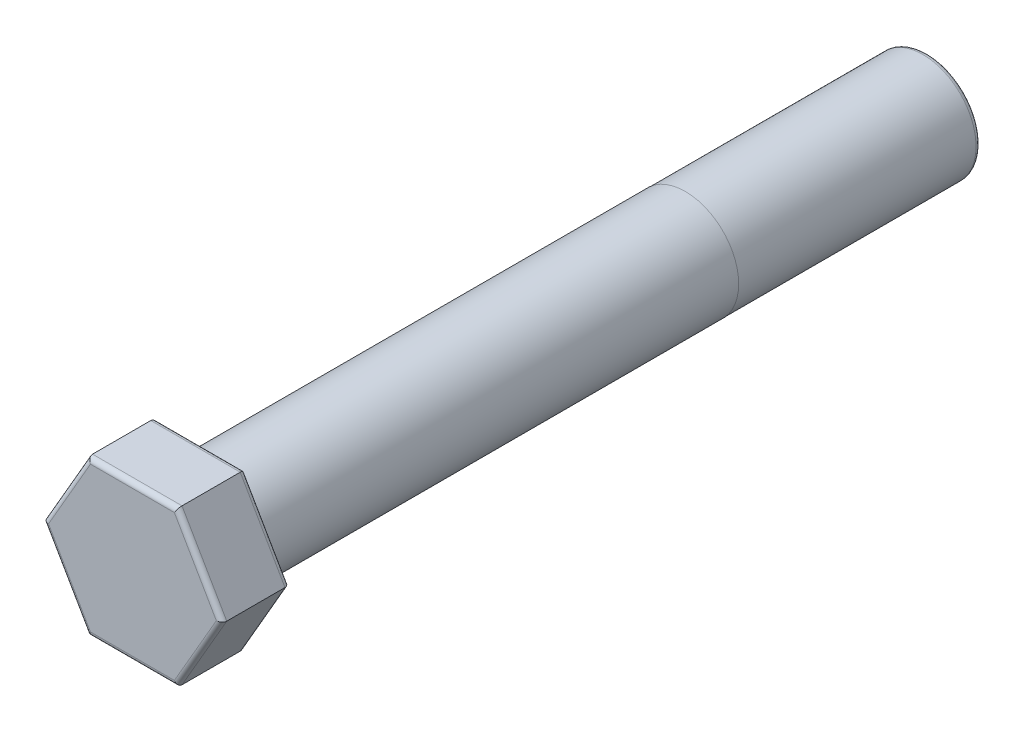
ISO-10303-21;
HEADER;
FILE_DESCRIPTION(('STEP AP214'),'2;1');
FILE_NAME('part.step','',(''),(''),'','','');
FILE_SCHEMA(('AUTOMOTIVE_DESIGN { 1 0 10303 214 1 1 1 1 }'));
ENDSEC;
DATA;
#1=APPLICATION_CONTEXT('core data for automotive mechanical design processes');
#2=APPLICATION_PROTOCOL_DEFINITION('international standard','automotive_design',2000,#1);
#3=PRODUCT_CONTEXT('',#1,'mechanical');
#4=PRODUCT('Part','Part','',(#3));
#5=PRODUCT_RELATED_PRODUCT_CATEGORY('part','',(#4));
#6=PRODUCT_DEFINITION_FORMATION('','',#4);
#7=PRODUCT_DEFINITION_CONTEXT('part definition',#1,'design');
#8=PRODUCT_DEFINITION('design','',#6,#7);
#9=PRODUCT_DEFINITION_SHAPE('','',#8);
#10=(LENGTH_UNIT() NAMED_UNIT(*) SI_UNIT(.MILLI.,.METRE.));
#11=(NAMED_UNIT(*) PLANE_ANGLE_UNIT() SI_UNIT($,.RADIAN.));
#12=(NAMED_UNIT(*) SI_UNIT($,.STERADIAN.) SOLID_ANGLE_UNIT());
#13=UNCERTAINTY_MEASURE_WITH_UNIT(LENGTH_MEASURE(1.E-05),#10,'distance_accuracy_value','');
#14=(GEOMETRIC_REPRESENTATION_CONTEXT(3) GLOBAL_UNCERTAINTY_ASSIGNED_CONTEXT((#13)) GLOBAL_UNIT_ASSIGNED_CONTEXT((#10,
#11,#12)) REPRESENTATION_CONTEXT('',''));
#15=CARTESIAN_POINT('',(0.,0.,0.));
#16=DIRECTION('',(0.,0.,1.));
#17=DIRECTION('',(1.,0.,0.));
#18=AXIS2_PLACEMENT_3D('',#15,#16,#17);
#19=CARTESIAN_POINT('',(0.,0.,-100.));
#20=DIRECTION('',(0.,0.,-1.));
#21=DIRECTION('',(-1.,0.,0.));
#22=AXIS2_PLACEMENT_3D('',#19,#20,#21);
#23=PLANE('',#22);
#24=CARTESIAN_POINT('',(0.,0.,-100.));
#25=DIRECTION('',(0.,0.,-1.));
#26=DIRECTION('',(-1.,0.,0.));
#27=AXIS2_PLACEMENT_3D('',#24,#25,#26);
#28=CIRCLE('',#27,11.);
#29=CARTESIAN_POINT('',(-11.,0.,-100.));
#30=VERTEX_POINT('',#29);
#31=EDGE_CURVE('E245',#30,#30,#28,.T.);
#32=ORIENTED_EDGE('',*,*,#31,.T.);
#33=EDGE_LOOP('',(#32));
#34=FACE_BOUND('',#33,.T.);
#35=CARTESIAN_POINT('',(0.,0.,-100.));
#36=DIRECTION('',(0.,0.,-1.));
#37=DIRECTION('',(-1.,0.,0.));
#38=AXIS2_PLACEMENT_3D('',#35,#36,#37);
#39=CIRCLE('',#38,10.95);
#40=CARTESIAN_POINT('',(-10.95,0.,-100.));
#41=VERTEX_POINT('',#40);
#42=EDGE_CURVE('E178',#41,#41,#39,.T.);
#43=ORIENTED_EDGE('',*,*,#42,.F.);
#44=EDGE_LOOP('',(#43));
#45=FACE_BOUND('',#44,.T.);
#46=ADVANCED_FACE('F34',(#34,#45),#23,.T.);
#47=CARTESIAN_POINT('',(9.225,-15.9781686998229,0.));
#48=DIRECTION('',(0.,0.,1.));
#49=DIRECTION('',(1.,0.,0.));
#50=AXIS2_PLACEMENT_3D('',#47,#48,#49);
#51=PLANE('',#50);
#52=DIRECTION('',(-0.5,-0.866025403784439,0.));
#53=VECTOR('',#52,1.);
#54=CARTESIAN_POINT('',(-17.5839745962156,-0.499999999999997,0.));
#55=LINE('',#54,#53);
#56=CARTESIAN_POINT('',(-17.2952994616207,0.,0.));
#57=VERTEX_POINT('',#56);
#58=CARTESIAN_POINT('',(-8.64764973081037,14.9781686998229,0.));
#59=VERTEX_POINT('',#58);
#60=EDGE_CURVE('E221',#57,#59,#55,.F.);
#61=ORIENTED_EDGE('',*,*,#60,.T.);
#62=DIRECTION('',(-1.,0.,0.));
#63=VECTOR('',#62,1.);
#64=CARTESIAN_POINT('',(9.225,14.9781686998229,0.));
#65=LINE('',#64,#63);
#66=CARTESIAN_POINT('',(8.64764973081037,14.9781686998229,0.));
#67=VERTEX_POINT('',#66);
#68=EDGE_CURVE('E136',#59,#67,#65,.F.);
#69=ORIENTED_EDGE('',*,*,#68,.T.);
#70=DIRECTION('',(-0.5,0.866025403784439,0.));
#71=VECTOR('',#70,1.);
#72=CARTESIAN_POINT('',(22.1964745962156,-8.48908434991144,0.));
#73=LINE('',#72,#71);
#74=CARTESIAN_POINT('',(17.2952994616207,0.,0.));
#75=VERTEX_POINT('',#74);
#76=EDGE_CURVE('E227',#67,#75,#73,.F.);
#77=ORIENTED_EDGE('',*,*,#76,.T.);
#78=DIRECTION('',(0.5,0.866025403784439,0.));
#79=VECTOR('',#78,1.);
#80=CARTESIAN_POINT('',(8.35897459621556,-15.4781686998229,0.));
#81=LINE('',#80,#79);
#82=CARTESIAN_POINT('',(8.64764973081037,-14.9781686998229,0.));
#83=VERTEX_POINT('',#82);
#84=EDGE_CURVE('E229',#75,#83,#81,.F.);
#85=ORIENTED_EDGE('',*,*,#84,.T.);
#86=DIRECTION('',(1.,0.,0.));
#87=VECTOR('',#86,1.);
#88=CARTESIAN_POINT('',(9.225,-14.9781686998229,0.));
#89=LINE('',#88,#87);
#90=CARTESIAN_POINT('',(-8.64764973081037,-14.9781686998229,0.));
#91=VERTEX_POINT('',#90);
#92=EDGE_CURVE('E225',#83,#91,#89,.F.);
#93=ORIENTED_EDGE('',*,*,#92,.T.);
#94=DIRECTION('',(0.5,-0.866025403784439,0.));
#95=VECTOR('',#94,1.);
#96=CARTESIAN_POINT('',(-3.74647459621556,-23.4672530497343,0.));
#97=LINE('',#96,#95);
#98=EDGE_CURVE('E223',#91,#57,#97,.F.);
#99=ORIENTED_EDGE('',*,*,#98,.T.);
#100=EDGE_LOOP('',(#61,#69,#77,#85,#93,#99));
#101=FACE_BOUND('',#100,.T.);
#102=CARTESIAN_POINT('',(0.,0.,0.));
#103=DIRECTION('',(0.,0.,1.));
#104=DIRECTION('',(1.,0.,0.));
#105=AXIS2_PLACEMENT_3D('',#102,#103,#104);
#106=CIRCLE('',#105,11.);
#107=CARTESIAN_POINT('',(11.,0.,0.));
#108=VERTEX_POINT('',#107);
#109=EDGE_CURVE('E157',#108,#108,#106,.F.);
#110=ORIENTED_EDGE('',*,*,#109,.F.);
#111=EDGE_LOOP('',(#110));
#112=FACE_BOUND('',#111,.T.);
#113=ADVANCED_FACE('F254',(#101,#112),#51,.F.);
#114=CARTESIAN_POINT('',(-9.225,-15.9781686998229,14.));
#115=DIRECTION('',(0.,1.,0.));
#116=DIRECTION('',(0.,0.,1.));
#117=AXIS2_PLACEMENT_3D('',#114,#115,#116);
#118=PLANE('',#117);
#119=DIRECTION('',(0.,0.,-1.));
#120=VECTOR('',#119,1.);
#121=CARTESIAN_POINT('',(-9.225,-15.9781686998229,14.));
#122=LINE('',#121,#120);
#123=CARTESIAN_POINT('',(-9.225,-15.9781686998229,13.));
#124=VERTEX_POINT('',#123);
#125=CARTESIAN_POINT('',(-9.225,-15.9781686998229,0.999999999999999));
#126=VERTEX_POINT('',#125);
#127=EDGE_CURVE('E242',#124,#126,#122,.T.);
#128=ORIENTED_EDGE('',*,*,#127,.T.);
#129=DIRECTION('',(1.,0.,0.));
#130=VECTOR('',#129,1.);
#131=CARTESIAN_POINT('',(-9.225,-15.9781686998229,0.999999999999999));
#132=LINE('',#131,#130);
#133=CARTESIAN_POINT('',(9.225,-15.9781686998229,0.999999999999999));
#134=VERTEX_POINT('',#133);
#135=EDGE_CURVE('E209',#126,#134,#132,.T.);
#136=ORIENTED_EDGE('',*,*,#135,.T.);
#137=DIRECTION('',(0.,0.,-1.));
#138=VECTOR('',#137,1.);
#139=CARTESIAN_POINT('',(9.225,-15.9781686998229,14.));
#140=LINE('',#139,#138);
#141=CARTESIAN_POINT('',(9.225,-15.9781686998229,13.));
#142=VERTEX_POINT('',#141);
#143=EDGE_CURVE('E234',#142,#134,#140,.T.);
#144=ORIENTED_EDGE('',*,*,#143,.F.);
#145=DIRECTION('',(1.,0.,0.));
#146=VECTOR('',#145,1.);
#147=CARTESIAN_POINT('',(-9.225,-15.9781686998229,13.));
#148=LINE('',#147,#146);
#149=EDGE_CURVE('E211',#142,#124,#148,.F.);
#150=ORIENTED_EDGE('',*,*,#149,.T.);
#151=EDGE_LOOP('',(#128,#136,#144,#150));
#152=FACE_BOUND('',#151,.T.);
#153=ADVANCED_FACE('F260',(#152),#118,.F.);
#154=CARTESIAN_POINT('',(9.225,-15.9781686998229,14.));
#155=DIRECTION('',(-0.866025403784439,0.5,0.));
#156=DIRECTION('',(-0.5,-0.866025403784439,0.));
#157=AXIS2_PLACEMENT_3D('',#154,#155,#156);
#158=PLANE('',#157);
#159=ORIENTED_EDGE('',*,*,#143,.T.);
#160=DIRECTION('',(0.5,0.866025403784439,0.));
#161=VECTOR('',#160,1.);
#162=CARTESIAN_POINT('',(9.225,-15.9781686998229,0.999999999999999));
#163=LINE('',#162,#161);
#164=CARTESIAN_POINT('',(18.45,0.,0.999999999999999));
#165=VERTEX_POINT('',#164);
#166=EDGE_CURVE('E201',#134,#165,#163,.T.);
#167=ORIENTED_EDGE('',*,*,#166,.T.);
#168=DIRECTION('',(0.,0.,-1.));
#169=VECTOR('',#168,1.);
#170=CARTESIAN_POINT('',(18.45,0.,14.));
#171=LINE('',#170,#169);
#172=CARTESIAN_POINT('',(18.45,0.,13.));
#173=VERTEX_POINT('',#172);
#174=EDGE_CURVE('E237',#173,#165,#171,.T.);
#175=ORIENTED_EDGE('',*,*,#174,.F.);
#176=DIRECTION('',(0.5,0.866025403784439,0.));
#177=VECTOR('',#176,1.);
#178=CARTESIAN_POINT('',(9.225,-15.9781686998229,13.));
#179=LINE('',#178,#177);
#180=EDGE_CURVE('E203',#173,#142,#179,.F.);
#181=ORIENTED_EDGE('',*,*,#180,.T.);
#182=EDGE_LOOP('',(#159,#167,#175,#181));
#183=FACE_BOUND('',#182,.T.);
#184=ADVANCED_FACE('F284',(#183),#158,.F.);
#185=CARTESIAN_POINT('',(18.45,0.,14.));
#186=DIRECTION('',(-0.866025403784439,-0.5,0.));
#187=DIRECTION('',(0.5,-0.866025403784439,0.));
#188=AXIS2_PLACEMENT_3D('',#185,#186,#187);
#189=PLANE('',#188);
#190=ORIENTED_EDGE('',*,*,#174,.T.);
#191=DIRECTION('',(-0.5,0.866025403784439,0.));
#192=VECTOR('',#191,1.);
#193=CARTESIAN_POINT('',(18.45,0.,0.999999999999999));
#194=LINE('',#193,#192);
#195=CARTESIAN_POINT('',(9.22499999999999,15.9781686998229,0.999999999999999));
#196=VERTEX_POINT('',#195);
#197=EDGE_CURVE('E205',#165,#196,#194,.T.);
#198=ORIENTED_EDGE('',*,*,#197,.T.);
#199=DIRECTION('',(0.,0.,-1.));
#200=VECTOR('',#199,1.);
#201=CARTESIAN_POINT('',(9.22499999999999,15.9781686998229,14.));
#202=LINE('',#201,#200);
#203=CARTESIAN_POINT('',(9.22499999999999,15.9781686998229,13.));
#204=VERTEX_POINT('',#203);
#205=EDGE_CURVE('E147',#204,#196,#202,.T.);
#206=ORIENTED_EDGE('',*,*,#205,.F.);
#207=DIRECTION('',(-0.5,0.866025403784439,0.));
#208=VECTOR('',#207,1.);
#209=CARTESIAN_POINT('',(18.45,0.,13.));
#210=LINE('',#209,#208);
#211=EDGE_CURVE('E207',#204,#173,#210,.F.);
#212=ORIENTED_EDGE('',*,*,#211,.T.);
#213=EDGE_LOOP('',(#190,#198,#206,#212));
#214=FACE_BOUND('',#213,.T.);
#215=ADVANCED_FACE('F281',(#214),#189,.F.);
#216=CARTESIAN_POINT('',(9.22499999999999,15.9781686998229,14.));
#217=DIRECTION('',(0.,-1.,0.));
#218=DIRECTION('',(0.,0.,-1.));
#219=AXIS2_PLACEMENT_3D('',#216,#217,#218);
#220=PLANE('',#219);
#221=ORIENTED_EDGE('',*,*,#205,.T.);
#222=DIRECTION('',(-1.,0.,0.));
#223=VECTOR('',#222,1.);
#224=CARTESIAN_POINT('',(9.22499999999999,15.9781686998229,0.999999999999999));
#225=LINE('',#224,#223);
#226=CARTESIAN_POINT('',(-9.225,15.9781686998229,0.999999999999999));
#227=VERTEX_POINT('',#226);
#228=EDGE_CURVE('E146',#196,#227,#225,.T.);
#229=ORIENTED_EDGE('',*,*,#228,.T.);
#230=DIRECTION('',(0.,0.,-1.));
#231=VECTOR('',#230,1.);
#232=CARTESIAN_POINT('',(-9.225,15.9781686998229,14.));
#233=LINE('',#232,#231);
#234=CARTESIAN_POINT('',(-9.225,15.9781686998229,13.));
#235=VERTEX_POINT('',#234);
#236=EDGE_CURVE('E129',#235,#227,#233,.T.);
#237=ORIENTED_EDGE('',*,*,#236,.F.);
#238=DIRECTION('',(-1.,0.,0.));
#239=VECTOR('',#238,1.);
#240=CARTESIAN_POINT('',(9.22499999999999,15.9781686998229,13.));
#241=LINE('',#240,#239);
#242=EDGE_CURVE('E143',#235,#204,#241,.F.);
#243=ORIENTED_EDGE('',*,*,#242,.T.);
#244=EDGE_LOOP('',(#221,#229,#237,#243));
#245=FACE_BOUND('',#244,.T.);
#246=ADVANCED_FACE('F142',(#245),#220,.F.);
#247=CARTESIAN_POINT('',(-9.225,15.9781686998229,14.));
#248=DIRECTION('',(0.866025403784439,-0.5,0.));
#249=DIRECTION('',(0.5,0.866025403784439,0.));
#250=AXIS2_PLACEMENT_3D('',#247,#248,#249);
#251=PLANE('',#250);
#252=ORIENTED_EDGE('',*,*,#236,.T.);
#253=DIRECTION('',(-0.5,-0.866025403784439,0.));
#254=VECTOR('',#253,1.);
#255=CARTESIAN_POINT('',(-9.225,15.9781686998229,0.999999999999999));
#256=LINE('',#255,#254);
#257=CARTESIAN_POINT('',(-18.45,0.,0.999999999999999));
#258=VERTEX_POINT('',#257);
#259=EDGE_CURVE('E135',#227,#258,#256,.T.);
#260=ORIENTED_EDGE('',*,*,#259,.T.);
#261=DIRECTION('',(0.,0.,-1.));
#262=VECTOR('',#261,1.);
#263=CARTESIAN_POINT('',(-18.45,0.,14.));
#264=LINE('',#263,#262);
#265=CARTESIAN_POINT('',(-18.45,0.,13.));
#266=VERTEX_POINT('',#265);
#267=EDGE_CURVE('E131',#266,#258,#264,.T.);
#268=ORIENTED_EDGE('',*,*,#267,.F.);
#269=DIRECTION('',(-0.5,-0.866025403784439,0.));
#270=VECTOR('',#269,1.);
#271=CARTESIAN_POINT('',(-9.22499999999999,15.9781686998229,13.));
#272=LINE('',#271,#270);
#273=EDGE_CURVE('E126',#266,#235,#272,.F.);
#274=ORIENTED_EDGE('',*,*,#273,.T.);
#275=EDGE_LOOP('',(#252,#260,#268,#274));
#276=FACE_BOUND('',#275,.T.);
#277=ADVANCED_FACE('F128',(#276),#251,.F.);
#278=CARTESIAN_POINT('',(-18.45,0.,14.));
#279=DIRECTION('',(0.866025403784439,0.5,0.));
#280=DIRECTION('',(-0.5,0.866025403784439,0.));
#281=AXIS2_PLACEMENT_3D('',#278,#279,#280);
#282=PLANE('',#281);
#283=ORIENTED_EDGE('',*,*,#267,.T.);
#284=DIRECTION('',(0.5,-0.866025403784439,0.));
#285=VECTOR('',#284,1.);
#286=CARTESIAN_POINT('',(-18.45,0.,0.999999999999999));
#287=LINE('',#286,#285);
#288=EDGE_CURVE('E214',#258,#126,#287,.T.);
#289=ORIENTED_EDGE('',*,*,#288,.T.);
#290=ORIENTED_EDGE('',*,*,#127,.F.);
#291=DIRECTION('',(0.5,-0.866025403784439,0.));
#292=VECTOR('',#291,1.);
#293=CARTESIAN_POINT('',(-18.45,0.,13.));
#294=LINE('',#293,#292);
#295=EDGE_CURVE('E216',#124,#266,#294,.F.);
#296=ORIENTED_EDGE('',*,*,#295,.T.);
#297=EDGE_LOOP('',(#283,#289,#290,#296));
#298=FACE_BOUND('',#297,.T.);
#299=ADVANCED_FACE('F272',(#298),#282,.F.);
#300=CARTESIAN_POINT('',(9.225,-15.9781686998229,14.));
#301=DIRECTION('',(0.,0.,1.));
#302=DIRECTION('',(1.,0.,0.));
#303=AXIS2_PLACEMENT_3D('',#300,#301,#302);
#304=PLANE('',#303);
#305=DIRECTION('',(0.5,-0.866025403784439,0.));
#306=VECTOR('',#305,1.);
#307=CARTESIAN_POINT('',(-8.35897459621556,-15.4781686998229,14.));
#308=LINE('',#307,#306);
#309=CARTESIAN_POINT('',(-17.2952994616207,0.,14.));
#310=VERTEX_POINT('',#309);
#311=CARTESIAN_POINT('',(-8.64764973081037,-14.9781686998229,14.));
#312=VERTEX_POINT('',#311);
#313=EDGE_CURVE('E51',#310,#312,#308,.T.);
#314=ORIENTED_EDGE('',*,*,#313,.T.);
#315=DIRECTION('',(1.,0.,0.));
#316=VECTOR('',#315,1.);
#317=CARTESIAN_POINT('',(9.225,-14.9781686998229,14.));
#318=LINE('',#317,#316);
#319=CARTESIAN_POINT('',(8.64764973081037,-14.9781686998229,14.));
#320=VERTEX_POINT('',#319);
#321=EDGE_CURVE('E191',#312,#320,#318,.T.);
#322=ORIENTED_EDGE('',*,*,#321,.T.);
#323=DIRECTION('',(0.5,0.866025403784439,0.));
#324=VECTOR('',#323,1.);
#325=CARTESIAN_POINT('',(17.5839745962156,0.5,14.));
#326=LINE('',#325,#324);
#327=CARTESIAN_POINT('',(17.2952994616207,0.,14.));
#328=VERTEX_POINT('',#327);
#329=EDGE_CURVE('E199',#320,#328,#326,.T.);
#330=ORIENTED_EDGE('',*,*,#329,.T.);
#331=DIRECTION('',(-0.5,0.866025403784439,0.));
#332=VECTOR('',#331,1.);
#333=CARTESIAN_POINT('',(8.35897459621555,15.4781686998229,14.));
#334=LINE('',#333,#332);
#335=CARTESIAN_POINT('',(8.64764973081037,14.9781686998229,14.));
#336=VERTEX_POINT('',#335);
#337=EDGE_CURVE('E197',#328,#336,#334,.T.);
#338=ORIENTED_EDGE('',*,*,#337,.T.);
#339=DIRECTION('',(-1.,0.,0.));
#340=VECTOR('',#339,1.);
#341=CARTESIAN_POINT('',(-9.225,14.9781686998229,14.));
#342=LINE('',#341,#340);
#343=CARTESIAN_POINT('',(-8.64764973081037,14.9781686998229,14.));
#344=VERTEX_POINT('',#343);
#345=EDGE_CURVE('E195',#336,#344,#342,.T.);
#346=ORIENTED_EDGE('',*,*,#345,.T.);
#347=DIRECTION('',(-0.5,-0.866025403784439,0.));
#348=VECTOR('',#347,1.);
#349=CARTESIAN_POINT('',(-17.5839745962156,-0.499999999999996,14.));
#350=LINE('',#349,#348);
#351=EDGE_CURVE('E56',#344,#310,#350,.T.);
#352=ORIENTED_EDGE('',*,*,#351,.T.);
#353=EDGE_LOOP('',(#314,#322,#330,#338,#346,#352));
#354=FACE_BOUND('',#353,.T.);
#355=ADVANCED_FACE('F269',(#354),#304,.T.);
#356=CARTESIAN_POINT('',(0.,0.,-100.));
#357=DIRECTION('',(0.,0.,1.));
#358=DIRECTION('',(1.,0.,0.));
#359=AXIS2_PLACEMENT_3D('',#356,#357,#358);
#360=CYLINDRICAL_SURFACE('',#359,11.);
#361=ORIENTED_EDGE('',*,*,#31,.F.);
#362=EDGE_LOOP('',(#361));
#363=FACE_BOUND('',#362,.T.);
#364=ORIENTED_EDGE('',*,*,#109,.T.);
#365=EDGE_LOOP('',(#364));
#366=FACE_BOUND('',#365,.T.);
#367=ADVANCED_FACE('F266',(#363,#366),#360,.T.);
#368=CARTESIAN_POINT('',(0.,0.,-150.));
#369=DIRECTION('',(0.,0.,1.));
#370=DIRECTION('',(1.,0.,0.));
#371=AXIS2_PLACEMENT_3D('',#368,#369,#370);
#372=CYLINDRICAL_SURFACE('',#371,10.95);
#373=CARTESIAN_POINT('',(0.,0.,-149.));
#374=DIRECTION('',(0.,0.,-1.));
#375=DIRECTION('',(-1.,0.,0.));
#376=AXIS2_PLACEMENT_3D('',#373,#374,#375);
#377=CIRCLE('',#376,10.95);
#378=CARTESIAN_POINT('',(-10.95,0.,-149.));
#379=VERTEX_POINT('',#378);
#380=EDGE_CURVE('E11',#379,#379,#377,.F.);
#381=ORIENTED_EDGE('',*,*,#380,.T.);
#382=EDGE_LOOP('',(#381));
#383=FACE_BOUND('',#382,.T.);
#384=ORIENTED_EDGE('',*,*,#42,.T.);
#385=EDGE_LOOP('',(#384));
#386=FACE_BOUND('',#385,.T.);
#387=ADVANCED_FACE('F251',(#383,#386),#372,.T.);
#388=CARTESIAN_POINT('',(0.,0.,-150.));
#389=DIRECTION('',(0.,0.,-1.));
#390=DIRECTION('',(-1.,0.,0.));
#391=AXIS2_PLACEMENT_3D('',#388,#389,#390);
#392=PLANE('',#391);
#393=CARTESIAN_POINT('',(0.,0.,-150.));
#394=DIRECTION('',(0.,0.,-1.));
#395=DIRECTION('',(-1.,0.,0.));
#396=AXIS2_PLACEMENT_3D('',#393,#394,#395);
#397=CIRCLE('',#396,9.95);
#398=CARTESIAN_POINT('',(-9.95,0.,-150.));
#399=VERTEX_POINT('',#398);
#400=EDGE_CURVE('E43',#399,#399,#397,.T.);
#401=ORIENTED_EDGE('',*,*,#400,.T.);
#402=EDGE_LOOP('',(#401));
#403=FACE_BOUND('',#402,.T.);
#404=ADVANCED_FACE('F315',(#403),#392,.T.);
#405=CARTESIAN_POINT('',(-9.225,-14.9781686998229,0.999999999999999));
#406=DIRECTION('',(1.,0.,0.));
#407=DIRECTION('',(0.,0.,-1.));
#408=AXIS2_PLACEMENT_3D('',#405,#406,#407);
#409=CYLINDRICAL_SURFACE('',#408,1.);
#410=CARTESIAN_POINT('',(-8.64764973081037,-14.9781686998229,0.999999999999999));
#411=DIRECTION('',(0.866025403784439,-0.5,0.));
#412=DIRECTION('',(0.5,0.866025403784439,0.));
#413=AXIS2_PLACEMENT_3D('',#410,#411,#412);
#414=ELLIPSE('',#413,1.15470053837925,1.);
#415=EDGE_CURVE('E179',#91,#126,#414,.F.);
#416=ORIENTED_EDGE('',*,*,#415,.F.);
#417=ORIENTED_EDGE('',*,*,#92,.F.);
#418=CARTESIAN_POINT('',(8.64764973081037,-14.9781686998229,0.999999999999999));
#419=DIRECTION('',(0.866025403784439,0.5,0.));
#420=DIRECTION('',(-0.5,0.866025403784439,0.));
#421=AXIS2_PLACEMENT_3D('',#418,#419,#420);
#422=ELLIPSE('',#421,1.15470053837925,1.);
#423=EDGE_CURVE('E175',#134,#83,#422,.T.);
#424=ORIENTED_EDGE('',*,*,#423,.F.);
#425=ORIENTED_EDGE('',*,*,#135,.F.);
#426=EDGE_LOOP('',(#416,#417,#424,#425));
#427=FACE_BOUND('',#426,.T.);
#428=ADVANCED_FACE('F311',(#427),#409,.T.);
#429=CARTESIAN_POINT('',(8.35897459621556,-15.4781686998229,0.999999999999999));
#430=DIRECTION('',(0.5,0.866025403784439,0.));
#431=DIRECTION('',(-0.866025403784439,0.5,0.));
#432=AXIS2_PLACEMENT_3D('',#429,#430,#431);
#433=CYLINDRICAL_SURFACE('',#432,1.);
#434=ORIENTED_EDGE('',*,*,#423,.T.);
#435=ORIENTED_EDGE('',*,*,#84,.F.);
#436=CARTESIAN_POINT('',(17.2952994616207,0.,0.999999999999999));
#437=DIRECTION('',(0.,1.,0.));
#438=DIRECTION('',(1.,0.,0.));
#439=AXIS2_PLACEMENT_3D('',#436,#437,#438);
#440=ELLIPSE('',#439,1.15470053837925,1.);
#441=EDGE_CURVE('E182',#165,#75,#440,.T.);
#442=ORIENTED_EDGE('',*,*,#441,.F.);
#443=ORIENTED_EDGE('',*,*,#166,.F.);
#444=EDGE_LOOP('',(#434,#435,#442,#443));
#445=FACE_BOUND('',#444,.T.);
#446=ADVANCED_FACE('F307',(#445),#433,.T.);
#447=CARTESIAN_POINT('',(-17.5839745962156,0.500000000000004,0.999999999999999));
#448=DIRECTION('',(0.5,-0.866025403784439,0.));
#449=DIRECTION('',(0.866025403784439,0.5,0.));
#450=AXIS2_PLACEMENT_3D('',#447,#448,#449);
#451=CYLINDRICAL_SURFACE('',#450,1.);
#452=ORIENTED_EDGE('',*,*,#415,.T.);
#453=ORIENTED_EDGE('',*,*,#288,.F.);
#454=CARTESIAN_POINT('',(-17.2952994616207,0.,0.999999999999999));
#455=DIRECTION('',(0.,-1.,0.));
#456=DIRECTION('',(1.,0.,0.));
#457=AXIS2_PLACEMENT_3D('',#454,#455,#456);
#458=ELLIPSE('',#457,1.15470053837925,1.);
#459=EDGE_CURVE('E185',#57,#258,#458,.F.);
#460=ORIENTED_EDGE('',*,*,#459,.F.);
#461=ORIENTED_EDGE('',*,*,#98,.F.);
#462=EDGE_LOOP('',(#452,#453,#460,#461));
#463=FACE_BOUND('',#462,.T.);
#464=ADVANCED_FACE('F303',(#463),#451,.T.);
#465=CARTESIAN_POINT('',(17.5839745962156,-0.500000000000002,0.999999999999999));
#466=DIRECTION('',(-0.5,0.866025403784439,0.));
#467=DIRECTION('',(-0.866025403784439,-0.5,0.));
#468=AXIS2_PLACEMENT_3D('',#465,#466,#467);
#469=CYLINDRICAL_SURFACE('',#468,1.);
#470=ORIENTED_EDGE('',*,*,#441,.T.);
#471=ORIENTED_EDGE('',*,*,#76,.F.);
#472=CARTESIAN_POINT('',(8.64764973081037,14.9781686998229,0.999999999999999));
#473=DIRECTION('',(-0.866025403784439,0.5,0.));
#474=DIRECTION('',(0.5,0.866025403784439,0.));
#475=AXIS2_PLACEMENT_3D('',#472,#473,#474);
#476=ELLIPSE('',#475,1.15470053837925,1.);
#477=EDGE_CURVE('E161',#196,#67,#476,.T.);
#478=ORIENTED_EDGE('',*,*,#477,.F.);
#479=ORIENTED_EDGE('',*,*,#197,.F.);
#480=EDGE_LOOP('',(#470,#471,#478,#479));
#481=FACE_BOUND('',#480,.T.);
#482=ADVANCED_FACE('F299',(#481),#469,.T.);
#483=CARTESIAN_POINT('',(-8.35897459621556,15.4781686998229,0.999999999999999));
#484=DIRECTION('',(-0.5,-0.866025403784439,0.));
#485=DIRECTION('',(0.866025403784439,-0.5,0.));
#486=AXIS2_PLACEMENT_3D('',#483,#484,#485);
#487=CYLINDRICAL_SURFACE('',#486,1.);
#488=ORIENTED_EDGE('',*,*,#459,.T.);
#489=ORIENTED_EDGE('',*,*,#259,.F.);
#490=CARTESIAN_POINT('',(-8.64764973081037,14.9781686998229,0.999999999999999));
#491=DIRECTION('',(-0.866025403784439,-0.5,0.));
#492=DIRECTION('',(0.5,-0.866025403784439,0.));
#493=AXIS2_PLACEMENT_3D('',#490,#491,#492);
#494=ELLIPSE('',#493,1.15470053837925,1.);
#495=EDGE_CURVE('E160',#59,#227,#494,.F.);
#496=ORIENTED_EDGE('',*,*,#495,.F.);
#497=ORIENTED_EDGE('',*,*,#60,.F.);
#498=EDGE_LOOP('',(#488,#489,#496,#497));
#499=FACE_BOUND('',#498,.T.);
#500=ADVANCED_FACE('F295',(#499),#487,.T.);
#501=CARTESIAN_POINT('',(9.22499999999999,14.9781686998229,0.999999999999999));
#502=DIRECTION('',(-1.,0.,0.));
#503=DIRECTION('',(0.,0.,1.));
#504=AXIS2_PLACEMENT_3D('',#501,#502,#503);
#505=CYLINDRICAL_SURFACE('',#504,1.);
#506=ORIENTED_EDGE('',*,*,#477,.T.);
#507=ORIENTED_EDGE('',*,*,#68,.F.);
#508=ORIENTED_EDGE('',*,*,#495,.T.);
#509=ORIENTED_EDGE('',*,*,#228,.F.);
#510=EDGE_LOOP('',(#506,#507,#508,#509));
#511=FACE_BOUND('',#510,.T.);
#512=ADVANCED_FACE('F292',(#511),#505,.T.);
#513=CARTESIAN_POINT('',(9.225,14.9781686998229,13.));
#514=DIRECTION('',(1.,0.,0.));
#515=DIRECTION('',(0.,0.,-1.));
#516=AXIS2_PLACEMENT_3D('',#513,#514,#515);
#517=CYLINDRICAL_SURFACE('',#516,1.);
#518=CARTESIAN_POINT('',(8.64764973081037,14.9781686998229,13.));
#519=DIRECTION('',(0.866025403784439,-0.5,0.));
#520=DIRECTION('',(-0.5,-0.866025403784439,0.));
#521=AXIS2_PLACEMENT_3D('',#518,#519,#520);
#522=ELLIPSE('',#521,1.15470053837925,1.);
#523=EDGE_CURVE('E155',#204,#336,#522,.T.);
#524=ORIENTED_EDGE('',*,*,#523,.F.);
#525=ORIENTED_EDGE('',*,*,#242,.F.);
#526=CARTESIAN_POINT('',(-8.64764973081036,14.9781686998229,13.));
#527=DIRECTION('',(0.866025403784439,0.5,0.));
#528=DIRECTION('',(0.5,-0.866025403784439,0.));
#529=AXIS2_PLACEMENT_3D('',#526,#527,#528);
#530=ELLIPSE('',#529,1.15470053837925,1.);
#531=EDGE_CURVE('E38',#344,#235,#530,.F.);
#532=ORIENTED_EDGE('',*,*,#531,.F.);
#533=ORIENTED_EDGE('',*,*,#345,.F.);
#534=EDGE_LOOP('',(#524,#525,#532,#533));
#535=FACE_BOUND('',#534,.T.);
#536=ADVANCED_FACE('F152',(#535),#517,.T.);
#537=CARTESIAN_POINT('',(-17.5839745962156,-0.499999999999997,13.));
#538=DIRECTION('',(0.5,0.866025403784439,0.));
#539=DIRECTION('',(-0.866025403784439,0.5,0.));
#540=AXIS2_PLACEMENT_3D('',#537,#538,#539);
#541=CYLINDRICAL_SURFACE('',#540,1.);
#542=ORIENTED_EDGE('',*,*,#531,.T.);
#543=ORIENTED_EDGE('',*,*,#273,.F.);
#544=CARTESIAN_POINT('',(-17.2952994616207,0.,13.));
#545=DIRECTION('',(0.,1.,0.));
#546=DIRECTION('',(1.,0.,0.));
#547=AXIS2_PLACEMENT_3D('',#544,#545,#546);
#548=ELLIPSE('',#547,1.15470053837925,1.);
#549=EDGE_CURVE('E163',#310,#266,#548,.F.);
#550=ORIENTED_EDGE('',*,*,#549,.F.);
#551=ORIENTED_EDGE('',*,*,#351,.F.);
#552=EDGE_LOOP('',(#542,#543,#550,#551));
#553=FACE_BOUND('',#552,.T.);
#554=ADVANCED_FACE('F159',(#553),#541,.T.);
#555=CARTESIAN_POINT('',(22.1964745962156,-8.48908434991144,13.));
#556=DIRECTION('',(0.5,-0.866025403784439,0.));
#557=DIRECTION('',(0.866025403784439,0.5,0.));
#558=AXIS2_PLACEMENT_3D('',#555,#556,#557);
#559=CYLINDRICAL_SURFACE('',#558,1.);
#560=ORIENTED_EDGE('',*,*,#523,.T.);
#561=ORIENTED_EDGE('',*,*,#337,.F.);
#562=CARTESIAN_POINT('',(17.2952994616207,0.,13.));
#563=DIRECTION('',(0.,-1.,0.));
#564=DIRECTION('',(-1.,0.,0.));
#565=AXIS2_PLACEMENT_3D('',#562,#563,#564);
#566=ELLIPSE('',#565,1.15470053837925,1.);
#567=EDGE_CURVE('E166',#173,#328,#566,.T.);
#568=ORIENTED_EDGE('',*,*,#567,.F.);
#569=ORIENTED_EDGE('',*,*,#211,.F.);
#570=EDGE_LOOP('',(#560,#561,#568,#569));
#571=FACE_BOUND('',#570,.T.);
#572=ADVANCED_FACE('F328',(#571),#559,.T.);
#573=CARTESIAN_POINT('',(-3.74647459621556,-23.4672530497343,13.));
#574=DIRECTION('',(-0.5,0.866025403784439,0.));
#575=DIRECTION('',(-0.866025403784439,-0.5,0.));
#576=AXIS2_PLACEMENT_3D('',#573,#574,#575);
#577=CYLINDRICAL_SURFACE('',#576,1.);
#578=ORIENTED_EDGE('',*,*,#549,.T.);
#579=ORIENTED_EDGE('',*,*,#295,.F.);
#580=CARTESIAN_POINT('',(-8.64764973081037,-14.9781686998229,13.));
#581=DIRECTION('',(-0.866025403784439,0.5,0.));
#582=DIRECTION('',(0.5,0.866025403784439,0.));
#583=AXIS2_PLACEMENT_3D('',#580,#581,#582);
#584=ELLIPSE('',#583,1.15470053837925,1.);
#585=EDGE_CURVE('E171',#312,#124,#584,.F.);
#586=ORIENTED_EDGE('',*,*,#585,.F.);
#587=ORIENTED_EDGE('',*,*,#313,.F.);
#588=EDGE_LOOP('',(#578,#579,#586,#587));
#589=FACE_BOUND('',#588,.T.);
#590=ADVANCED_FACE('F324',(#589),#577,.T.);
#591=CARTESIAN_POINT('',(8.35897459621556,-15.4781686998229,13.));
#592=DIRECTION('',(-0.5,-0.866025403784439,0.));
#593=DIRECTION('',(0.866025403784439,-0.5,0.));
#594=AXIS2_PLACEMENT_3D('',#591,#592,#593);
#595=CYLINDRICAL_SURFACE('',#594,1.);
#596=ORIENTED_EDGE('',*,*,#567,.T.);
#597=ORIENTED_EDGE('',*,*,#329,.F.);
#598=CARTESIAN_POINT('',(8.64764973081037,-14.9781686998229,13.));
#599=DIRECTION('',(-0.866025403784439,-0.5,0.));
#600=DIRECTION('',(0.5,-0.866025403784439,0.));
#601=AXIS2_PLACEMENT_3D('',#598,#599,#600);
#602=ELLIPSE('',#601,1.15470053837925,1.);
#603=EDGE_CURVE('E173',#142,#320,#602,.T.);
#604=ORIENTED_EDGE('',*,*,#603,.F.);
#605=ORIENTED_EDGE('',*,*,#180,.F.);
#606=EDGE_LOOP('',(#596,#597,#604,#605));
#607=FACE_BOUND('',#606,.T.);
#608=ADVANCED_FACE('F320',(#607),#595,.T.);
#609=CARTESIAN_POINT('',(9.225,-14.9781686998229,13.));
#610=DIRECTION('',(-1.,0.,0.));
#611=DIRECTION('',(0.,0.,1.));
#612=AXIS2_PLACEMENT_3D('',#609,#610,#611);
#613=CYLINDRICAL_SURFACE('',#612,1.);
#614=ORIENTED_EDGE('',*,*,#585,.T.);
#615=ORIENTED_EDGE('',*,*,#149,.F.);
#616=ORIENTED_EDGE('',*,*,#603,.T.);
#617=ORIENTED_EDGE('',*,*,#321,.F.);
#618=EDGE_LOOP('',(#614,#615,#616,#617));
#619=FACE_BOUND('',#618,.T.);
#620=ADVANCED_FACE('F317',(#619),#613,.T.);
#621=CARTESIAN_POINT('',(0.,0.,-149.));
#622=DIRECTION('',(0.,0.,-1.));
#623=DIRECTION('',(-1.,0.,0.));
#624=AXIS2_PLACEMENT_3D('',#621,#622,#623);
#625=TOROIDAL_SURFACE('',#624,9.95,1.);
#626=ORIENTED_EDGE('',*,*,#380,.F.);
#627=EDGE_LOOP('',(#626));
#628=FACE_BOUND('',#627,.T.);
#629=ORIENTED_EDGE('',*,*,#400,.F.);
#630=EDGE_LOOP('',(#629));
#631=FACE_BOUND('',#630,.T.);
#632=ADVANCED_FACE('F36',(#628,#631),#625,.T.);
#633=CLOSED_SHELL('',(#46,#113,#153,#184,#215,#246,#277,#299,#355,#367,#387,#404,#428,#446,#464,
#482,#500,#512,#536,#554,#572,#590,#608,#620,#632));
#634=MANIFOLD_SOLID_BREP('B2',#633);
#635=ADVANCED_BREP_SHAPE_REPRESENTATION('',(#18,#634),#14);
#636=SHAPE_DEFINITION_REPRESENTATION(#9,#635);
ENDSEC;
END-ISO-10303-21;
